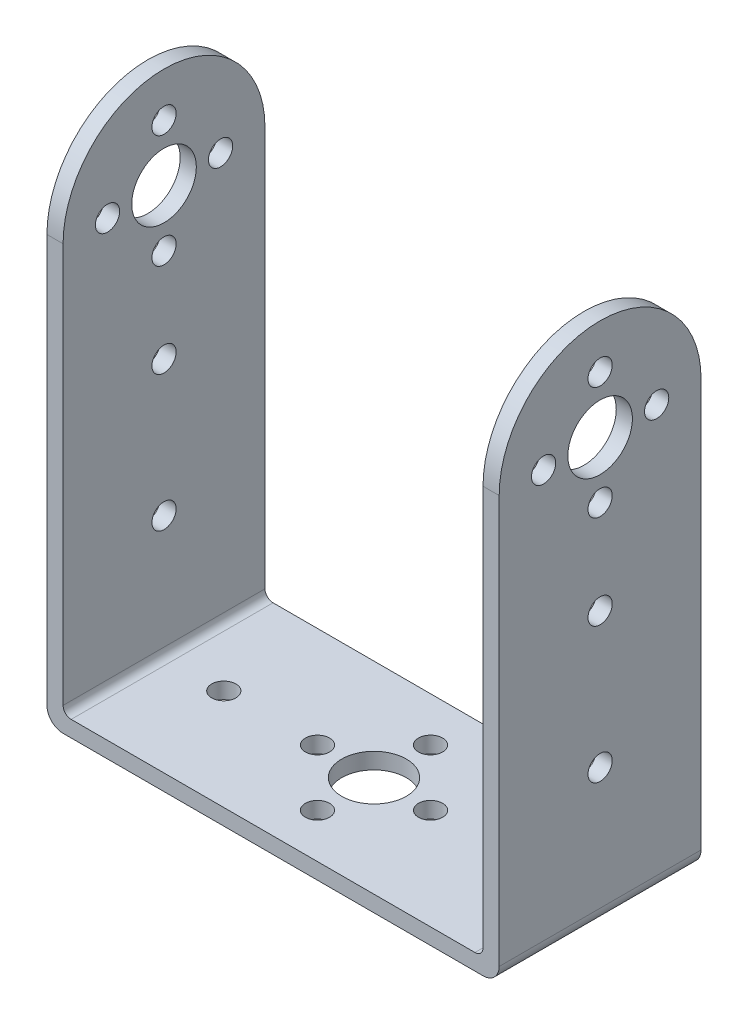
ISO-10303-21;
HEADER;
FILE_DESCRIPTION(('STEP AP214'),'2;1');
FILE_NAME('part.step','',(''),(''),'','','');
FILE_SCHEMA(('AUTOMOTIVE_DESIGN { 1 0 10303 214 1 1 1 1 }'));
ENDSEC;
DATA;
#1=APPLICATION_CONTEXT('core data for automotive mechanical design processes');
#2=APPLICATION_PROTOCOL_DEFINITION('international standard','automotive_design',2000,#1);
#3=PRODUCT_CONTEXT('',#1,'mechanical');
#4=PRODUCT('Part','Part','',(#3));
#5=PRODUCT_RELATED_PRODUCT_CATEGORY('part','',(#4));
#6=PRODUCT_DEFINITION_FORMATION('','',#4);
#7=PRODUCT_DEFINITION_CONTEXT('part definition',#1,'design');
#8=PRODUCT_DEFINITION('design','',#6,#7);
#9=PRODUCT_DEFINITION_SHAPE('','',#8);
#10=(LENGTH_UNIT() NAMED_UNIT(*) SI_UNIT(.MILLI.,.METRE.));
#11=(NAMED_UNIT(*) PLANE_ANGLE_UNIT() SI_UNIT($,.RADIAN.));
#12=(NAMED_UNIT(*) SI_UNIT($,.STERADIAN.) SOLID_ANGLE_UNIT());
#13=UNCERTAINTY_MEASURE_WITH_UNIT(LENGTH_MEASURE(1.E-05),#10,'distance_accuracy_value','');
#14=(GEOMETRIC_REPRESENTATION_CONTEXT(3) GLOBAL_UNCERTAINTY_ASSIGNED_CONTEXT((#13)) GLOBAL_UNIT_ASSIGNED_CONTEXT((#10,
#11,#12)) REPRESENTATION_CONTEXT('',''));
#15=CARTESIAN_POINT('',(0.,0.,0.));
#16=DIRECTION('',(0.,0.,1.));
#17=DIRECTION('',(1.,0.,0.));
#18=AXIS2_PLACEMENT_3D('',#15,#16,#17);
#19=CARTESIAN_POINT('',(1.99999999999998,99.5,0.));
#20=DIRECTION('',(-1.,0.,0.));
#21=DIRECTION('',(0.,-1.,0.));
#22=AXIS2_PLACEMENT_3D('',#19,#20,#21);
#23=PLANE('',#22);
#24=CARTESIAN_POINT('',(2.,50.,5.5));
#25=DIRECTION('',(1.,0.,0.));
#26=DIRECTION('',(0.,0.,-1.));
#27=AXIS2_PLACEMENT_3D('',#24,#25,#26);
#28=CIRCLE('',#27,1.49999999999999);
#29=CARTESIAN_POINT('',(2.,50.,4.00000000000001));
#30=VERTEX_POINT('',#29);
#31=EDGE_CURVE('E310',#30,#30,#28,.T.);
#32=ORIENTED_EDGE('',*,*,#31,.F.);
#33=EDGE_LOOP('',(#32));
#34=FACE_BOUND('',#33,.T.);
#35=CARTESIAN_POINT('',(2.,57.,12.5));
#36=DIRECTION('',(1.,0.,0.));
#37=DIRECTION('',(0.,0.,-1.));
#38=AXIS2_PLACEMENT_3D('',#35,#36,#37);
#39=CIRCLE('',#38,1.49999999999999);
#40=CARTESIAN_POINT('',(2.,57.,11.));
#41=VERTEX_POINT('',#40);
#42=EDGE_CURVE('E304',#41,#41,#39,.T.);
#43=ORIENTED_EDGE('',*,*,#42,.F.);
#44=EDGE_LOOP('',(#43));
#45=FACE_BOUND('',#44,.T.);
#46=CARTESIAN_POINT('',(2.,31.4,12.5));
#47=DIRECTION('',(1.,0.,0.));
#48=DIRECTION('',(0.,0.,-1.));
#49=AXIS2_PLACEMENT_3D('',#46,#47,#48);
#50=CIRCLE('',#49,1.49999999999999);
#51=CARTESIAN_POINT('',(2.,31.4,11.));
#52=VERTEX_POINT('',#51);
#53=EDGE_CURVE('E298',#52,#52,#50,.T.);
#54=ORIENTED_EDGE('',*,*,#53,.F.);
#55=EDGE_LOOP('',(#54));
#56=FACE_BOUND('',#55,.T.);
#57=CARTESIAN_POINT('',(2.,43.,12.5));
#58=DIRECTION('',(1.,0.,0.));
#59=DIRECTION('',(0.,0.,-1.));
#60=AXIS2_PLACEMENT_3D('',#57,#58,#59);
#61=CIRCLE('',#60,1.49999999999999);
#62=CARTESIAN_POINT('',(2.,43.,11.));
#63=VERTEX_POINT('',#62);
#64=EDGE_CURVE('E292',#63,#63,#61,.T.);
#65=ORIENTED_EDGE('',*,*,#64,.F.);
#66=EDGE_LOOP('',(#65));
#67=FACE_BOUND('',#66,.T.);
#68=CARTESIAN_POINT('',(2.,50.,19.5));
#69=DIRECTION('',(1.,0.,0.));
#70=DIRECTION('',(0.,0.,-1.));
#71=AXIS2_PLACEMENT_3D('',#68,#69,#70);
#72=CIRCLE('',#71,1.49999999999999);
#73=CARTESIAN_POINT('',(2.,50.,18.));
#74=VERTEX_POINT('',#73);
#75=EDGE_CURVE('E286',#74,#74,#72,.T.);
#76=ORIENTED_EDGE('',*,*,#75,.F.);
#77=EDGE_LOOP('',(#76));
#78=FACE_BOUND('',#77,.T.);
#79=CARTESIAN_POINT('',(2.,50.,12.5));
#80=DIRECTION('',(1.,0.,0.));
#81=DIRECTION('',(0.,0.,-1.));
#82=AXIS2_PLACEMENT_3D('',#79,#80,#81);
#83=CIRCLE('',#82,3.99999999999999);
#84=CARTESIAN_POINT('',(2.,50.,8.50000000000001));
#85=VERTEX_POINT('',#84);
#86=EDGE_CURVE('E238',#85,#85,#83,.T.);
#87=ORIENTED_EDGE('',*,*,#86,.F.);
#88=EDGE_LOOP('',(#87));
#89=FACE_BOUND('',#88,.T.);
#90=DIRECTION('',(0.,-1.,0.));
#91=VECTOR('',#90,1.);
#92=CARTESIAN_POINT('',(1.99999999999999,50.,25.));
#93=LINE('',#92,#91);
#94=CARTESIAN_POINT('',(1.99999999999999,50.,25.));
#95=VERTEX_POINT('',#94);
#96=CARTESIAN_POINT('',(2.,0.5,25.));
#97=VERTEX_POINT('',#96);
#98=EDGE_CURVE('E154',#95,#97,#93,.T.);
#99=ORIENTED_EDGE('',*,*,#98,.T.);
#100=DIRECTION('',(0.,0.,1.));
#101=VECTOR('',#100,1.);
#102=CARTESIAN_POINT('',(2.,0.5,0.));
#103=LINE('',#102,#101);
#104=CARTESIAN_POINT('',(2.,0.5,0.));
#105=VERTEX_POINT('',#104);
#106=EDGE_CURVE('E133',#97,#105,#103,.F.);
#107=ORIENTED_EDGE('',*,*,#106,.T.);
#108=DIRECTION('',(0.,-1.,0.));
#109=VECTOR('',#108,1.);
#110=CARTESIAN_POINT('',(1.99999999999998,99.5,0.));
#111=LINE('',#110,#109);
#112=CARTESIAN_POINT('',(1.99999999999999,50.,0.));
#113=VERTEX_POINT('',#112);
#114=EDGE_CURVE('E126',#113,#105,#111,.T.);
#115=ORIENTED_EDGE('',*,*,#114,.F.);
#116=CARTESIAN_POINT('',(1.99999999999999,50.,12.5));
#117=DIRECTION('',(-1.,0.,0.));
#118=DIRECTION('',(0.,-1.,0.));
#119=AXIS2_PLACEMENT_3D('',#116,#117,#118);
#120=CIRCLE('',#119,12.5);
#121=EDGE_CURVE('E130',#113,#95,#120,.F.);
#122=ORIENTED_EDGE('',*,*,#121,.T.);
#123=EDGE_LOOP('',(#99,#107,#115,#122));
#124=FACE_BOUND('',#123,.T.);
#125=CARTESIAN_POINT('',(2.,14.6,12.5));
#126=DIRECTION('',(1.,0.,0.));
#127=DIRECTION('',(0.,0.,-1.));
#128=AXIS2_PLACEMENT_3D('',#125,#126,#127);
#129=CIRCLE('',#128,1.49999999999999);
#130=CARTESIAN_POINT('',(2.,14.6,11.));
#131=VERTEX_POINT('',#130);
#132=EDGE_CURVE('E280',#131,#131,#129,.T.);
#133=ORIENTED_EDGE('',*,*,#132,.F.);
#134=EDGE_LOOP('',(#133));
#135=FACE_BOUND('',#134,.T.);
#136=ADVANCED_FACE('F34',(#34,#45,#56,#67,#78,#89,#124,#135),#23,.F.);
#137=CARTESIAN_POINT('',(0.,50.,12.5));
#138=DIRECTION('',(1.,0.,0.));
#139=DIRECTION('',(0.,0.,-1.));
#140=AXIS2_PLACEMENT_3D('',#137,#138,#139);
#141=CYLINDRICAL_SURFACE('',#140,12.5);
#142=CARTESIAN_POINT('',(54.,50.,12.5));
#143=DIRECTION('',(1.,0.,0.));
#144=DIRECTION('',(0.,0.,-1.));
#145=AXIS2_PLACEMENT_3D('',#142,#143,#144);
#146=CIRCLE('',#145,12.5);
#147=CARTESIAN_POINT('',(54.,50.,25.));
#148=VERTEX_POINT('',#147);
#149=CARTESIAN_POINT('',(54.,50.,0.));
#150=VERTEX_POINT('',#149);
#151=EDGE_CURVE('E148',#148,#150,#146,.F.);
#152=ORIENTED_EDGE('',*,*,#151,.F.);
#153=DIRECTION('',(1.,0.,0.));
#154=VECTOR('',#153,1.);
#155=CARTESIAN_POINT('',(0.,50.,25.));
#156=LINE('',#155,#154);
#157=CARTESIAN_POINT('',(56.,50.,25.));
#158=VERTEX_POINT('',#157);
#159=EDGE_CURVE('E169',#148,#158,#156,.T.);
#160=ORIENTED_EDGE('',*,*,#159,.T.);
#161=CARTESIAN_POINT('',(56.,50.,12.5));
#162=DIRECTION('',(1.,0.,0.));
#163=DIRECTION('',(0.,0.,-1.));
#164=AXIS2_PLACEMENT_3D('',#161,#162,#163);
#165=CIRCLE('',#164,12.5);
#166=CARTESIAN_POINT('',(56.,50.,0.));
#167=VERTEX_POINT('',#166);
#168=EDGE_CURVE('E213',#167,#158,#165,.T.);
#169=ORIENTED_EDGE('',*,*,#168,.F.);
#170=DIRECTION('',(1.,0.,0.));
#171=VECTOR('',#170,1.);
#172=CARTESIAN_POINT('',(0.,50.,0.));
#173=LINE('',#172,#171);
#174=EDGE_CURVE('E155',#150,#167,#173,.T.);
#175=ORIENTED_EDGE('',*,*,#174,.F.);
#176=EDGE_LOOP('',(#152,#160,#169,#175));
#177=FACE_BOUND('',#176,.T.);
#178=ADVANCED_FACE('F391',(#177),#141,.T.);
#179=ORIENTED_EDGE('',*,*,#121,.F.);
#180=CARTESIAN_POINT('',(0.,50.,0.));
#181=VERTEX_POINT('',#180);
#182=EDGE_CURVE('E145',#181,#113,#173,.T.);
#183=ORIENTED_EDGE('',*,*,#182,.F.);
#184=CARTESIAN_POINT('',(0.,50.,12.5));
#185=DIRECTION('',(1.,0.,0.));
#186=DIRECTION('',(0.,0.,-1.));
#187=AXIS2_PLACEMENT_3D('',#184,#185,#186);
#188=CIRCLE('',#187,12.5);
#189=CARTESIAN_POINT('',(0.,50.,25.));
#190=VERTEX_POINT('',#189);
#191=EDGE_CURVE('E208',#181,#190,#188,.T.);
#192=ORIENTED_EDGE('',*,*,#191,.T.);
#193=EDGE_CURVE('E147',#190,#95,#156,.T.);
#194=ORIENTED_EDGE('',*,*,#193,.T.);
#195=EDGE_LOOP('',(#179,#183,#192,#194));
#196=FACE_BOUND('',#195,.T.);
#197=ADVANCED_FACE('F143',(#196),#141,.T.);
#198=CARTESIAN_POINT('',(0.,-2.5,0.));
#199=DIRECTION('',(0.,0.,-1.));
#200=DIRECTION('',(-1.,0.,0.));
#201=AXIS2_PLACEMENT_3D('',#198,#199,#200);
#202=PLANE('',#201);
#203=DIRECTION('',(1.,0.,0.));
#204=VECTOR('',#203,1.);
#205=CARTESIAN_POINT('',(0.,-2.5,0.));
#206=LINE('',#205,#204);
#207=CARTESIAN_POINT('',(2.,-2.5,0.));
#208=VERTEX_POINT('',#207);
#209=CARTESIAN_POINT('',(54.,-2.5,0.));
#210=VERTEX_POINT('',#209);
#211=EDGE_CURVE('E160',#208,#210,#206,.T.);
#212=ORIENTED_EDGE('',*,*,#211,.F.);
#213=CARTESIAN_POINT('',(2.,-0.500000000000002,0.));
#214=DIRECTION('',(0.,0.,-1.));
#215=DIRECTION('',(-1.,0.,0.));
#216=AXIS2_PLACEMENT_3D('',#213,#214,#215);
#217=CIRCLE('',#216,2.);
#218=CARTESIAN_POINT('',(0.,-0.500000000000002,0.));
#219=VERTEX_POINT('',#218);
#220=EDGE_CURVE('E194',#208,#219,#217,.T.);
#221=ORIENTED_EDGE('',*,*,#220,.T.);
#222=DIRECTION('',(0.,1.,0.));
#223=VECTOR('',#222,1.);
#224=CARTESIAN_POINT('',(0.,-2.5,0.));
#225=LINE('',#224,#223);
#226=EDGE_CURVE('E153',#219,#181,#225,.T.);
#227=ORIENTED_EDGE('',*,*,#226,.T.);
#228=ORIENTED_EDGE('',*,*,#182,.T.);
#229=ORIENTED_EDGE('',*,*,#114,.T.);
#230=CARTESIAN_POINT('',(3.,0.5,0.));
#231=DIRECTION('',(0.,0.,-1.));
#232=DIRECTION('',(-1.,0.,0.));
#233=AXIS2_PLACEMENT_3D('',#230,#231,#232);
#234=CIRCLE('',#233,1.);
#235=CARTESIAN_POINT('',(3.,-0.5,0.));
#236=VERTEX_POINT('',#235);
#237=EDGE_CURVE('E181',#105,#236,#234,.F.);
#238=ORIENTED_EDGE('',*,*,#237,.T.);
#239=DIRECTION('',(1.,0.,0.));
#240=VECTOR('',#239,1.);
#241=CARTESIAN_POINT('',(2.,-0.5,0.));
#242=LINE('',#241,#240);
#243=CARTESIAN_POINT('',(53.,-0.5,0.));
#244=VERTEX_POINT('',#243);
#245=EDGE_CURVE('E137',#236,#244,#242,.T.);
#246=ORIENTED_EDGE('',*,*,#245,.T.);
#247=CARTESIAN_POINT('',(53.,0.5,0.));
#248=DIRECTION('',(0.,0.,-1.));
#249=DIRECTION('',(-1.,0.,0.));
#250=AXIS2_PLACEMENT_3D('',#247,#248,#249);
#251=CIRCLE('',#250,1.);
#252=CARTESIAN_POINT('',(54.,0.5,0.));
#253=VERTEX_POINT('',#252);
#254=EDGE_CURVE('E185',#244,#253,#251,.F.);
#255=ORIENTED_EDGE('',*,*,#254,.T.);
#256=DIRECTION('',(0.,1.,0.));
#257=VECTOR('',#256,1.);
#258=CARTESIAN_POINT('',(54.,-0.5,0.));
#259=LINE('',#258,#257);
#260=EDGE_CURVE('E149',#253,#150,#259,.T.);
#261=ORIENTED_EDGE('',*,*,#260,.T.);
#262=ORIENTED_EDGE('',*,*,#174,.T.);
#263=DIRECTION('',(0.,1.,0.));
#264=VECTOR('',#263,1.);
#265=CARTESIAN_POINT('',(56.,-2.5,0.));
#266=LINE('',#265,#264);
#267=CARTESIAN_POINT('',(56.,-0.500000000000001,0.));
#268=VERTEX_POINT('',#267);
#269=EDGE_CURVE('E163',#268,#167,#266,.T.);
#270=ORIENTED_EDGE('',*,*,#269,.F.);
#271=CARTESIAN_POINT('',(54.,-0.500000000000001,0.));
#272=DIRECTION('',(0.,0.,-1.));
#273=DIRECTION('',(-1.,0.,0.));
#274=AXIS2_PLACEMENT_3D('',#271,#272,#273);
#275=CIRCLE('',#274,2.);
#276=EDGE_CURVE('E192',#268,#210,#275,.T.);
#277=ORIENTED_EDGE('',*,*,#276,.T.);
#278=EDGE_LOOP('',(#212,#221,#227,#228,#229,#238,#246,#255,#261,#262,#270,#277));
#279=FACE_BOUND('',#278,.T.);
#280=ADVANCED_FACE('F152',(#279),#202,.T.);
#281=CARTESIAN_POINT('',(0.,-2.5,25.));
#282=DIRECTION('',(0.,-1.,0.));
#283=DIRECTION('',(0.,0.,-1.));
#284=AXIS2_PLACEMENT_3D('',#281,#282,#283);
#285=PLANE('',#284);
#286=CARTESIAN_POINT('',(28.,-2.5,12.5));
#287=DIRECTION('',(0.,-1.,0.));
#288=DIRECTION('',(0.,0.,-1.));
#289=AXIS2_PLACEMENT_3D('',#286,#287,#288);
#290=CIRCLE('',#289,3.99999999999999);
#291=CARTESIAN_POINT('',(28.,-2.5,8.50000000000001));
#292=VERTEX_POINT('',#291);
#293=EDGE_CURVE('E352',#292,#292,#290,.T.);
#294=ORIENTED_EDGE('',*,*,#293,.F.);
#295=EDGE_LOOP('',(#294));
#296=FACE_BOUND('',#295,.T.);
#297=CARTESIAN_POINT('',(46.6,-2.5,12.5));
#298=DIRECTION('',(0.,-1.,0.));
#299=DIRECTION('',(0.,0.,-1.));
#300=AXIS2_PLACEMENT_3D('',#297,#298,#299);
#301=CIRCLE('',#300,1.49999999999999);
#302=CARTESIAN_POINT('',(46.6,-2.5,11.));
#303=VERTEX_POINT('',#302);
#304=EDGE_CURVE('E346',#303,#303,#301,.T.);
#305=ORIENTED_EDGE('',*,*,#304,.F.);
#306=EDGE_LOOP('',(#305));
#307=FACE_BOUND('',#306,.T.);
#308=CARTESIAN_POINT('',(21.,-2.5,12.5));
#309=DIRECTION('',(0.,-1.,0.));
#310=DIRECTION('',(0.,0.,-1.));
#311=AXIS2_PLACEMENT_3D('',#308,#309,#310);
#312=CIRCLE('',#311,1.49999999999999);
#313=CARTESIAN_POINT('',(21.,-2.5,11.));
#314=VERTEX_POINT('',#313);
#315=EDGE_CURVE('E340',#314,#314,#312,.T.);
#316=ORIENTED_EDGE('',*,*,#315,.F.);
#317=EDGE_LOOP('',(#316));
#318=FACE_BOUND('',#317,.T.);
#319=CARTESIAN_POINT('',(35.,-2.5,12.5));
#320=DIRECTION('',(0.,-1.,0.));
#321=DIRECTION('',(0.,0.,-1.));
#322=AXIS2_PLACEMENT_3D('',#319,#320,#321);
#323=CIRCLE('',#322,1.49999999999999);
#324=CARTESIAN_POINT('',(35.,-2.5,11.));
#325=VERTEX_POINT('',#324);
#326=EDGE_CURVE('E334',#325,#325,#323,.T.);
#327=ORIENTED_EDGE('',*,*,#326,.F.);
#328=EDGE_LOOP('',(#327));
#329=FACE_BOUND('',#328,.T.);
#330=CARTESIAN_POINT('',(9.4,-2.5,12.5));
#331=DIRECTION('',(0.,-1.,0.));
#332=DIRECTION('',(0.,0.,-1.));
#333=AXIS2_PLACEMENT_3D('',#330,#331,#332);
#334=CIRCLE('',#333,1.49999999999999);
#335=CARTESIAN_POINT('',(9.4,-2.5,11.));
#336=VERTEX_POINT('',#335);
#337=EDGE_CURVE('E328',#336,#336,#334,.T.);
#338=ORIENTED_EDGE('',*,*,#337,.F.);
#339=EDGE_LOOP('',(#338));
#340=FACE_BOUND('',#339,.T.);
#341=CARTESIAN_POINT('',(28.,-2.5,19.5));
#342=DIRECTION('',(0.,-1.,0.));
#343=DIRECTION('',(0.,0.,-1.));
#344=AXIS2_PLACEMENT_3D('',#341,#342,#343);
#345=CIRCLE('',#344,1.49999999999999);
#346=CARTESIAN_POINT('',(28.,-2.5,18.));
#347=VERTEX_POINT('',#346);
#348=EDGE_CURVE('E322',#347,#347,#345,.T.);
#349=ORIENTED_EDGE('',*,*,#348,.F.);
#350=EDGE_LOOP('',(#349));
#351=FACE_BOUND('',#350,.T.);
#352=CARTESIAN_POINT('',(28.,-2.5,5.5));
#353=DIRECTION('',(0.,-1.,0.));
#354=DIRECTION('',(0.,0.,-1.));
#355=AXIS2_PLACEMENT_3D('',#352,#353,#354);
#356=CIRCLE('',#355,1.49999999999999);
#357=CARTESIAN_POINT('',(28.,-2.5,4.00000000000001));
#358=VERTEX_POINT('',#357);
#359=EDGE_CURVE('E316',#358,#358,#356,.T.);
#360=ORIENTED_EDGE('',*,*,#359,.F.);
#361=EDGE_LOOP('',(#360));
#362=FACE_BOUND('',#361,.T.);
#363=DIRECTION('',(1.,0.,0.));
#364=VECTOR('',#363,1.);
#365=CARTESIAN_POINT('',(0.,-2.5,25.));
#366=LINE('',#365,#364);
#367=CARTESIAN_POINT('',(2.,-2.5,25.));
#368=VERTEX_POINT('',#367);
#369=CARTESIAN_POINT('',(54.,-2.5,25.));
#370=VERTEX_POINT('',#369);
#371=EDGE_CURVE('E167',#368,#370,#366,.T.);
#372=ORIENTED_EDGE('',*,*,#371,.F.);
#373=DIRECTION('',(0.,0.,-1.));
#374=VECTOR('',#373,1.);
#375=CARTESIAN_POINT('',(2.,-2.5,0.));
#376=LINE('',#375,#374);
#377=EDGE_CURVE('E189',#368,#208,#376,.T.);
#378=ORIENTED_EDGE('',*,*,#377,.T.);
#379=ORIENTED_EDGE('',*,*,#211,.T.);
#380=DIRECTION('',(0.,0.,-1.));
#381=VECTOR('',#380,1.);
#382=CARTESIAN_POINT('',(54.,-2.5,25.));
#383=LINE('',#382,#381);
#384=EDGE_CURVE('E187',#210,#370,#383,.F.);
#385=ORIENTED_EDGE('',*,*,#384,.T.);
#386=EDGE_LOOP('',(#372,#378,#379,#385));
#387=FACE_BOUND('',#386,.T.);
#388=ADVANCED_FACE('F204',(#296,#307,#318,#329,#340,#351,#362,#387),#285,.T.);
#389=CARTESIAN_POINT('',(0.,50.,25.));
#390=DIRECTION('',(0.,0.,1.));
#391=DIRECTION('',(1.,0.,0.));
#392=AXIS2_PLACEMENT_3D('',#389,#390,#391);
#393=PLANE('',#392);
#394=DIRECTION('',(0.,-1.,0.));
#395=VECTOR('',#394,1.);
#396=CARTESIAN_POINT('',(0.,50.,25.));
#397=LINE('',#396,#395);
#398=CARTESIAN_POINT('',(0.,-0.5,25.));
#399=VERTEX_POINT('',#398);
#400=EDGE_CURVE('E200',#190,#399,#397,.T.);
#401=ORIENTED_EDGE('',*,*,#400,.T.);
#402=CARTESIAN_POINT('',(2.,-0.500000000000001,25.));
#403=DIRECTION('',(0.,0.,1.));
#404=DIRECTION('',(1.,0.,0.));
#405=AXIS2_PLACEMENT_3D('',#402,#403,#404);
#406=CIRCLE('',#405,2.);
#407=EDGE_CURVE('E42',#399,#368,#406,.T.);
#408=ORIENTED_EDGE('',*,*,#407,.T.);
#409=ORIENTED_EDGE('',*,*,#371,.T.);
#410=CARTESIAN_POINT('',(54.,-0.5,25.));
#411=DIRECTION('',(0.,0.,1.));
#412=DIRECTION('',(1.,0.,0.));
#413=AXIS2_PLACEMENT_3D('',#410,#411,#412);
#414=CIRCLE('',#413,2.);
#415=CARTESIAN_POINT('',(56.,-0.5,25.));
#416=VERTEX_POINT('',#415);
#417=EDGE_CURVE('E49',#370,#416,#414,.T.);
#418=ORIENTED_EDGE('',*,*,#417,.T.);
#419=DIRECTION('',(0.,-1.,0.));
#420=VECTOR('',#419,1.);
#421=CARTESIAN_POINT('',(56.,50.,25.));
#422=LINE('',#421,#420);
#423=EDGE_CURVE('E215',#158,#416,#422,.T.);
#424=ORIENTED_EDGE('',*,*,#423,.F.);
#425=ORIENTED_EDGE('',*,*,#159,.F.);
#426=DIRECTION('',(0.,1.,0.));
#427=VECTOR('',#426,1.);
#428=CARTESIAN_POINT('',(54.,-0.5,25.));
#429=LINE('',#428,#427);
#430=CARTESIAN_POINT('',(54.,0.5,25.));
#431=VERTEX_POINT('',#430);
#432=EDGE_CURVE('E138',#431,#148,#429,.T.);
#433=ORIENTED_EDGE('',*,*,#432,.F.);
#434=CARTESIAN_POINT('',(53.,0.5,25.));
#435=DIRECTION('',(0.,0.,1.));
#436=DIRECTION('',(1.,0.,0.));
#437=AXIS2_PLACEMENT_3D('',#434,#435,#436);
#438=CIRCLE('',#437,1.);
#439=CARTESIAN_POINT('',(53.,-0.5,25.));
#440=VERTEX_POINT('',#439);
#441=EDGE_CURVE('E183',#431,#440,#438,.F.);
#442=ORIENTED_EDGE('',*,*,#441,.T.);
#443=DIRECTION('',(1.,0.,0.));
#444=VECTOR('',#443,1.);
#445=CARTESIAN_POINT('',(2.,-0.5,25.));
#446=LINE('',#445,#444);
#447=CARTESIAN_POINT('',(3.,-0.5,25.));
#448=VERTEX_POINT('',#447);
#449=EDGE_CURVE('E223',#448,#440,#446,.T.);
#450=ORIENTED_EDGE('',*,*,#449,.F.);
#451=CARTESIAN_POINT('',(3.,0.5,25.));
#452=DIRECTION('',(0.,0.,1.));
#453=DIRECTION('',(1.,0.,0.));
#454=AXIS2_PLACEMENT_3D('',#451,#452,#453);
#455=CIRCLE('',#454,1.);
#456=EDGE_CURVE('E179',#448,#97,#455,.F.);
#457=ORIENTED_EDGE('',*,*,#456,.T.);
#458=ORIENTED_EDGE('',*,*,#98,.F.);
#459=ORIENTED_EDGE('',*,*,#193,.F.);
#460=EDGE_LOOP('',(#401,#408,#409,#418,#424,#425,#433,#442,#450,#457,#458,#459));
#461=FACE_BOUND('',#460,.T.);
#462=ADVANCED_FACE('F199',(#461),#393,.T.);
#463=CARTESIAN_POINT('',(0.,50.,12.5));
#464=DIRECTION('',(1.,0.,0.));
#465=DIRECTION('',(0.,0.,-1.));
#466=AXIS2_PLACEMENT_3D('',#463,#464,#465);
#467=PLANE('',#466);
#468=CARTESIAN_POINT('',(0.,50.,5.5));
#469=DIRECTION('',(1.,0.,0.));
#470=DIRECTION('',(0.,0.,-1.));
#471=AXIS2_PLACEMENT_3D('',#468,#469,#470);
#472=CIRCLE('',#471,1.49999999999999);
#473=CARTESIAN_POINT('',(0.,50.,4.00000000000001));
#474=VERTEX_POINT('',#473);
#475=EDGE_CURVE('E307',#474,#474,#472,.T.);
#476=ORIENTED_EDGE('',*,*,#475,.T.);
#477=EDGE_LOOP('',(#476));
#478=FACE_BOUND('',#477,.T.);
#479=CARTESIAN_POINT('',(0.,57.,12.5));
#480=DIRECTION('',(1.,0.,0.));
#481=DIRECTION('',(0.,0.,-1.));
#482=AXIS2_PLACEMENT_3D('',#479,#480,#481);
#483=CIRCLE('',#482,1.49999999999999);
#484=CARTESIAN_POINT('',(0.,57.,11.));
#485=VERTEX_POINT('',#484);
#486=EDGE_CURVE('E301',#485,#485,#483,.T.);
#487=ORIENTED_EDGE('',*,*,#486,.T.);
#488=EDGE_LOOP('',(#487));
#489=FACE_BOUND('',#488,.T.);
#490=CARTESIAN_POINT('',(0.,31.4,12.5));
#491=DIRECTION('',(1.,0.,0.));
#492=DIRECTION('',(0.,0.,-1.));
#493=AXIS2_PLACEMENT_3D('',#490,#491,#492);
#494=CIRCLE('',#493,1.49999999999999);
#495=CARTESIAN_POINT('',(0.,31.4,11.));
#496=VERTEX_POINT('',#495);
#497=EDGE_CURVE('E295',#496,#496,#494,.T.);
#498=ORIENTED_EDGE('',*,*,#497,.T.);
#499=EDGE_LOOP('',(#498));
#500=FACE_BOUND('',#499,.T.);
#501=CARTESIAN_POINT('',(0.,43.,12.5));
#502=DIRECTION('',(1.,0.,0.));
#503=DIRECTION('',(0.,0.,-1.));
#504=AXIS2_PLACEMENT_3D('',#501,#502,#503);
#505=CIRCLE('',#504,1.49999999999999);
#506=CARTESIAN_POINT('',(0.,43.,11.));
#507=VERTEX_POINT('',#506);
#508=EDGE_CURVE('E289',#507,#507,#505,.T.);
#509=ORIENTED_EDGE('',*,*,#508,.T.);
#510=EDGE_LOOP('',(#509));
#511=FACE_BOUND('',#510,.T.);
#512=CARTESIAN_POINT('',(0.,50.,19.5));
#513=DIRECTION('',(1.,0.,0.));
#514=DIRECTION('',(0.,0.,-1.));
#515=AXIS2_PLACEMENT_3D('',#512,#513,#514);
#516=CIRCLE('',#515,1.49999999999999);
#517=CARTESIAN_POINT('',(0.,50.,18.));
#518=VERTEX_POINT('',#517);
#519=EDGE_CURVE('E283',#518,#518,#516,.T.);
#520=ORIENTED_EDGE('',*,*,#519,.T.);
#521=EDGE_LOOP('',(#520));
#522=FACE_BOUND('',#521,.T.);
#523=CARTESIAN_POINT('',(0.,14.6,12.5));
#524=DIRECTION('',(1.,0.,0.));
#525=DIRECTION('',(0.,0.,-1.));
#526=AXIS2_PLACEMENT_3D('',#523,#524,#525);
#527=CIRCLE('',#526,1.49999999999999);
#528=CARTESIAN_POINT('',(0.,14.6,11.));
#529=VERTEX_POINT('',#528);
#530=EDGE_CURVE('E277',#529,#529,#527,.T.);
#531=ORIENTED_EDGE('',*,*,#530,.T.);
#532=EDGE_LOOP('',(#531));
#533=FACE_BOUND('',#532,.T.);
#534=CARTESIAN_POINT('',(0.,50.,12.5));
#535=DIRECTION('',(1.,0.,0.));
#536=DIRECTION('',(0.,0.,-1.));
#537=AXIS2_PLACEMENT_3D('',#534,#535,#536);
#538=CIRCLE('',#537,3.99999999999999);
#539=CARTESIAN_POINT('',(0.,50.,8.50000000000001));
#540=VERTEX_POINT('',#539);
#541=EDGE_CURVE('E235',#540,#540,#538,.T.);
#542=ORIENTED_EDGE('',*,*,#541,.T.);
#543=EDGE_LOOP('',(#542));
#544=FACE_BOUND('',#543,.T.);
#545=ORIENTED_EDGE('',*,*,#226,.F.);
#546=DIRECTION('',(0.,0.,-1.));
#547=VECTOR('',#546,1.);
#548=CARTESIAN_POINT('',(0.,-0.500000000000001,25.));
#549=LINE('',#548,#547);
#550=EDGE_CURVE('E57',#219,#399,#549,.F.);
#551=ORIENTED_EDGE('',*,*,#550,.T.);
#552=ORIENTED_EDGE('',*,*,#400,.F.);
#553=ORIENTED_EDGE('',*,*,#191,.F.);
#554=EDGE_LOOP('',(#545,#551,#552,#553));
#555=FACE_BOUND('',#554,.T.);
#556=ADVANCED_FACE('F207',(#478,#489,#500,#511,#522,#533,#544,#555),#467,.F.);
#557=CARTESIAN_POINT('',(56.,50.,12.5));
#558=DIRECTION('',(1.,0.,0.));
#559=DIRECTION('',(0.,0.,-1.));
#560=AXIS2_PLACEMENT_3D('',#557,#558,#559);
#561=PLANE('',#560);
#562=CARTESIAN_POINT('',(56.,50.,5.5));
#563=DIRECTION('',(1.,0.,0.));
#564=DIRECTION('',(0.,0.,-1.));
#565=AXIS2_PLACEMENT_3D('',#562,#563,#564);
#566=CIRCLE('',#565,1.49999999999999);
#567=CARTESIAN_POINT('',(56.,50.,4.00000000000001));
#568=VERTEX_POINT('',#567);
#569=EDGE_CURVE('E274',#568,#568,#566,.T.);
#570=ORIENTED_EDGE('',*,*,#569,.F.);
#571=EDGE_LOOP('',(#570));
#572=FACE_BOUND('',#571,.T.);
#573=CARTESIAN_POINT('',(56.,57.,12.5));
#574=DIRECTION('',(1.,0.,0.));
#575=DIRECTION('',(0.,0.,-1.));
#576=AXIS2_PLACEMENT_3D('',#573,#574,#575);
#577=CIRCLE('',#576,1.49999999999999);
#578=CARTESIAN_POINT('',(56.,57.,11.));
#579=VERTEX_POINT('',#578);
#580=EDGE_CURVE('E268',#579,#579,#577,.T.);
#581=ORIENTED_EDGE('',*,*,#580,.F.);
#582=EDGE_LOOP('',(#581));
#583=FACE_BOUND('',#582,.T.);
#584=CARTESIAN_POINT('',(56.,31.4,12.5));
#585=DIRECTION('',(1.,0.,0.));
#586=DIRECTION('',(0.,0.,-1.));
#587=AXIS2_PLACEMENT_3D('',#584,#585,#586);
#588=CIRCLE('',#587,1.49999999999999);
#589=CARTESIAN_POINT('',(56.,31.4,11.));
#590=VERTEX_POINT('',#589);
#591=EDGE_CURVE('E262',#590,#590,#588,.T.);
#592=ORIENTED_EDGE('',*,*,#591,.F.);
#593=EDGE_LOOP('',(#592));
#594=FACE_BOUND('',#593,.T.);
#595=CARTESIAN_POINT('',(56.,43.,12.5));
#596=DIRECTION('',(1.,0.,0.));
#597=DIRECTION('',(0.,0.,-1.));
#598=AXIS2_PLACEMENT_3D('',#595,#596,#597);
#599=CIRCLE('',#598,1.49999999999999);
#600=CARTESIAN_POINT('',(56.,43.,11.));
#601=VERTEX_POINT('',#600);
#602=EDGE_CURVE('E256',#601,#601,#599,.T.);
#603=ORIENTED_EDGE('',*,*,#602,.F.);
#604=EDGE_LOOP('',(#603));
#605=FACE_BOUND('',#604,.T.);
#606=CARTESIAN_POINT('',(56.,50.,19.5));
#607=DIRECTION('',(1.,0.,0.));
#608=DIRECTION('',(0.,0.,-1.));
#609=AXIS2_PLACEMENT_3D('',#606,#607,#608);
#610=CIRCLE('',#609,1.49999999999999);
#611=CARTESIAN_POINT('',(56.,50.,18.));
#612=VERTEX_POINT('',#611);
#613=EDGE_CURVE('E250',#612,#612,#610,.T.);
#614=ORIENTED_EDGE('',*,*,#613,.F.);
#615=EDGE_LOOP('',(#614));
#616=FACE_BOUND('',#615,.T.);
#617=CARTESIAN_POINT('',(56.,14.6,12.5));
#618=DIRECTION('',(1.,0.,0.));
#619=DIRECTION('',(0.,0.,-1.));
#620=AXIS2_PLACEMENT_3D('',#617,#618,#619);
#621=CIRCLE('',#620,1.49999999999999);
#622=CARTESIAN_POINT('',(56.,14.6,11.));
#623=VERTEX_POINT('',#622);
#624=EDGE_CURVE('E244',#623,#623,#621,.T.);
#625=ORIENTED_EDGE('',*,*,#624,.F.);
#626=EDGE_LOOP('',(#625));
#627=FACE_BOUND('',#626,.T.);
#628=CARTESIAN_POINT('',(56.,50.,12.5));
#629=DIRECTION('',(1.,0.,0.));
#630=DIRECTION('',(0.,0.,-1.));
#631=AXIS2_PLACEMENT_3D('',#628,#629,#630);
#632=CIRCLE('',#631,3.99999999999999);
#633=CARTESIAN_POINT('',(56.,50.,8.50000000000001));
#634=VERTEX_POINT('',#633);
#635=EDGE_CURVE('E232',#634,#634,#632,.T.);
#636=ORIENTED_EDGE('',*,*,#635,.F.);
#637=EDGE_LOOP('',(#636));
#638=FACE_BOUND('',#637,.T.);
#639=ORIENTED_EDGE('',*,*,#423,.T.);
#640=DIRECTION('',(0.,0.,-1.));
#641=VECTOR('',#640,1.);
#642=CARTESIAN_POINT('',(56.,-0.5,12.5));
#643=LINE('',#642,#641);
#644=EDGE_CURVE('E11',#416,#268,#643,.T.);
#645=ORIENTED_EDGE('',*,*,#644,.T.);
#646=ORIENTED_EDGE('',*,*,#269,.T.);
#647=ORIENTED_EDGE('',*,*,#168,.T.);
#648=EDGE_LOOP('',(#639,#645,#646,#647));
#649=FACE_BOUND('',#648,.T.);
#650=ADVANCED_FACE('F407',(#572,#583,#594,#605,#616,#627,#638,#649),#561,.T.);
#651=CARTESIAN_POINT('',(54.,-0.5,0.));
#652=DIRECTION('',(1.,0.,0.));
#653=DIRECTION('',(0.,0.,-1.));
#654=AXIS2_PLACEMENT_3D('',#651,#652,#653);
#655=PLANE('',#654);
#656=CARTESIAN_POINT('',(54.,50.,5.5));
#657=DIRECTION('',(1.,0.,0.));
#658=DIRECTION('',(0.,0.,-1.));
#659=AXIS2_PLACEMENT_3D('',#656,#657,#658);
#660=CIRCLE('',#659,1.49999999999999);
#661=CARTESIAN_POINT('',(54.,50.,4.00000000000001));
#662=VERTEX_POINT('',#661);
#663=EDGE_CURVE('E271',#662,#662,#660,.T.);
#664=ORIENTED_EDGE('',*,*,#663,.T.);
#665=EDGE_LOOP('',(#664));
#666=FACE_BOUND('',#665,.T.);
#667=CARTESIAN_POINT('',(54.,57.,12.5));
#668=DIRECTION('',(1.,0.,0.));
#669=DIRECTION('',(0.,0.,-1.));
#670=AXIS2_PLACEMENT_3D('',#667,#668,#669);
#671=CIRCLE('',#670,1.49999999999999);
#672=CARTESIAN_POINT('',(54.,57.,11.));
#673=VERTEX_POINT('',#672);
#674=EDGE_CURVE('E265',#673,#673,#671,.T.);
#675=ORIENTED_EDGE('',*,*,#674,.T.);
#676=EDGE_LOOP('',(#675));
#677=FACE_BOUND('',#676,.T.);
#678=CARTESIAN_POINT('',(54.,31.4,12.5));
#679=DIRECTION('',(1.,0.,0.));
#680=DIRECTION('',(0.,0.,-1.));
#681=AXIS2_PLACEMENT_3D('',#678,#679,#680);
#682=CIRCLE('',#681,1.49999999999999);
#683=CARTESIAN_POINT('',(54.,31.4,11.));
#684=VERTEX_POINT('',#683);
#685=EDGE_CURVE('E259',#684,#684,#682,.T.);
#686=ORIENTED_EDGE('',*,*,#685,.T.);
#687=EDGE_LOOP('',(#686));
#688=FACE_BOUND('',#687,.T.);
#689=CARTESIAN_POINT('',(54.,43.,12.5));
#690=DIRECTION('',(1.,0.,0.));
#691=DIRECTION('',(0.,0.,-1.));
#692=AXIS2_PLACEMENT_3D('',#689,#690,#691);
#693=CIRCLE('',#692,1.49999999999999);
#694=CARTESIAN_POINT('',(54.,43.,11.));
#695=VERTEX_POINT('',#694);
#696=EDGE_CURVE('E253',#695,#695,#693,.T.);
#697=ORIENTED_EDGE('',*,*,#696,.T.);
#698=EDGE_LOOP('',(#697));
#699=FACE_BOUND('',#698,.T.);
#700=CARTESIAN_POINT('',(54.,50.,19.5));
#701=DIRECTION('',(1.,0.,0.));
#702=DIRECTION('',(0.,0.,-1.));
#703=AXIS2_PLACEMENT_3D('',#700,#701,#702);
#704=CIRCLE('',#703,1.49999999999999);
#705=CARTESIAN_POINT('',(54.,50.,18.));
#706=VERTEX_POINT('',#705);
#707=EDGE_CURVE('E247',#706,#706,#704,.T.);
#708=ORIENTED_EDGE('',*,*,#707,.T.);
#709=EDGE_LOOP('',(#708));
#710=FACE_BOUND('',#709,.T.);
#711=CARTESIAN_POINT('',(54.,14.6,12.5));
#712=DIRECTION('',(1.,0.,0.));
#713=DIRECTION('',(0.,0.,-1.));
#714=AXIS2_PLACEMENT_3D('',#711,#712,#713);
#715=CIRCLE('',#714,1.49999999999999);
#716=CARTESIAN_POINT('',(54.,14.6,11.));
#717=VERTEX_POINT('',#716);
#718=EDGE_CURVE('E241',#717,#717,#715,.T.);
#719=ORIENTED_EDGE('',*,*,#718,.T.);
#720=EDGE_LOOP('',(#719));
#721=FACE_BOUND('',#720,.T.);
#722=CARTESIAN_POINT('',(54.,50.,12.5));
#723=DIRECTION('',(1.,0.,0.));
#724=DIRECTION('',(0.,0.,-1.));
#725=AXIS2_PLACEMENT_3D('',#722,#723,#724);
#726=CIRCLE('',#725,4.);
#727=CARTESIAN_POINT('',(54.,50.,8.5));
#728=VERTEX_POINT('',#727);
#729=EDGE_CURVE('E226',#728,#728,#726,.T.);
#730=ORIENTED_EDGE('',*,*,#729,.T.);
#731=EDGE_LOOP('',(#730));
#732=FACE_BOUND('',#731,.T.);
#733=ORIENTED_EDGE('',*,*,#260,.F.);
#734=DIRECTION('',(0.,0.,1.));
#735=VECTOR('',#734,1.);
#736=CARTESIAN_POINT('',(54.,0.5,25.));
#737=LINE('',#736,#735);
#738=EDGE_CURVE('E176',#253,#431,#737,.T.);
#739=ORIENTED_EDGE('',*,*,#738,.T.);
#740=ORIENTED_EDGE('',*,*,#432,.T.);
#741=ORIENTED_EDGE('',*,*,#151,.T.);
#742=EDGE_LOOP('',(#733,#739,#740,#741));
#743=FACE_BOUND('',#742,.T.);
#744=ADVANCED_FACE('F411',(#666,#677,#688,#699,#710,#721,#732,#743),#655,.F.);
#745=CARTESIAN_POINT('',(2.,-0.5,0.));
#746=DIRECTION('',(0.,-1.,0.));
#747=DIRECTION('',(1.,0.,0.));
#748=AXIS2_PLACEMENT_3D('',#745,#746,#747);
#749=PLANE('',#748);
#750=CARTESIAN_POINT('',(28.,-0.5,12.5));
#751=DIRECTION('',(0.,-1.,0.));
#752=DIRECTION('',(1.,0.,0.));
#753=AXIS2_PLACEMENT_3D('',#750,#751,#752);
#754=CIRCLE('',#753,3.99999999999999);
#755=CARTESIAN_POINT('',(32.,-0.5,12.5));
#756=VERTEX_POINT('',#755);
#757=EDGE_CURVE('E349',#756,#756,#754,.T.);
#758=ORIENTED_EDGE('',*,*,#757,.T.);
#759=EDGE_LOOP('',(#758));
#760=FACE_BOUND('',#759,.T.);
#761=CARTESIAN_POINT('',(46.6,-0.5,12.5));
#762=DIRECTION('',(0.,-1.,0.));
#763=DIRECTION('',(1.,0.,0.));
#764=AXIS2_PLACEMENT_3D('',#761,#762,#763);
#765=CIRCLE('',#764,1.49999999999999);
#766=CARTESIAN_POINT('',(48.1,-0.5,12.5));
#767=VERTEX_POINT('',#766);
#768=EDGE_CURVE('E343',#767,#767,#765,.T.);
#769=ORIENTED_EDGE('',*,*,#768,.T.);
#770=EDGE_LOOP('',(#769));
#771=FACE_BOUND('',#770,.T.);
#772=CARTESIAN_POINT('',(21.,-0.5,12.5));
#773=DIRECTION('',(0.,-1.,0.));
#774=DIRECTION('',(1.,0.,0.));
#775=AXIS2_PLACEMENT_3D('',#772,#773,#774);
#776=CIRCLE('',#775,1.5);
#777=CARTESIAN_POINT('',(22.5,-0.5,12.5));
#778=VERTEX_POINT('',#777);
#779=EDGE_CURVE('E337',#778,#778,#776,.T.);
#780=ORIENTED_EDGE('',*,*,#779,.T.);
#781=EDGE_LOOP('',(#780));
#782=FACE_BOUND('',#781,.T.);
#783=CARTESIAN_POINT('',(35.,-0.5,12.5));
#784=DIRECTION('',(0.,-1.,0.));
#785=DIRECTION('',(1.,0.,0.));
#786=AXIS2_PLACEMENT_3D('',#783,#784,#785);
#787=CIRCLE('',#786,1.49999999999999);
#788=CARTESIAN_POINT('',(36.5,-0.5,12.5));
#789=VERTEX_POINT('',#788);
#790=EDGE_CURVE('E331',#789,#789,#787,.T.);
#791=ORIENTED_EDGE('',*,*,#790,.T.);
#792=EDGE_LOOP('',(#791));
#793=FACE_BOUND('',#792,.T.);
#794=CARTESIAN_POINT('',(9.4,-0.5,12.5));
#795=DIRECTION('',(0.,-1.,0.));
#796=DIRECTION('',(1.,0.,0.));
#797=AXIS2_PLACEMENT_3D('',#794,#795,#796);
#798=CIRCLE('',#797,1.5);
#799=CARTESIAN_POINT('',(10.9,-0.5,12.5));
#800=VERTEX_POINT('',#799);
#801=EDGE_CURVE('E325',#800,#800,#798,.T.);
#802=ORIENTED_EDGE('',*,*,#801,.T.);
#803=EDGE_LOOP('',(#802));
#804=FACE_BOUND('',#803,.T.);
#805=CARTESIAN_POINT('',(28.,-0.5,19.5));
#806=DIRECTION('',(0.,-1.,0.));
#807=DIRECTION('',(1.,0.,0.));
#808=AXIS2_PLACEMENT_3D('',#805,#806,#807);
#809=CIRCLE('',#808,1.5);
#810=CARTESIAN_POINT('',(29.5,-0.5,19.5));
#811=VERTEX_POINT('',#810);
#812=EDGE_CURVE('E319',#811,#811,#809,.T.);
#813=ORIENTED_EDGE('',*,*,#812,.T.);
#814=EDGE_LOOP('',(#813));
#815=FACE_BOUND('',#814,.T.);
#816=CARTESIAN_POINT('',(28.,-0.5,5.5));
#817=DIRECTION('',(0.,-1.,0.));
#818=DIRECTION('',(1.,0.,0.));
#819=AXIS2_PLACEMENT_3D('',#816,#817,#818);
#820=CIRCLE('',#819,1.5);
#821=CARTESIAN_POINT('',(29.5,-0.5,5.5));
#822=VERTEX_POINT('',#821);
#823=EDGE_CURVE('E313',#822,#822,#820,.T.);
#824=ORIENTED_EDGE('',*,*,#823,.T.);
#825=EDGE_LOOP('',(#824));
#826=FACE_BOUND('',#825,.T.);
#827=ORIENTED_EDGE('',*,*,#245,.F.);
#828=DIRECTION('',(0.,0.,1.));
#829=VECTOR('',#828,1.);
#830=CARTESIAN_POINT('',(3.,-0.5,25.));
#831=LINE('',#830,#829);
#832=EDGE_CURVE('E172',#236,#448,#831,.T.);
#833=ORIENTED_EDGE('',*,*,#832,.T.);
#834=ORIENTED_EDGE('',*,*,#449,.T.);
#835=DIRECTION('',(0.,0.,1.));
#836=VECTOR('',#835,1.);
#837=CARTESIAN_POINT('',(53.,-0.5,0.));
#838=LINE('',#837,#836);
#839=EDGE_CURVE('E157',#440,#244,#838,.F.);
#840=ORIENTED_EDGE('',*,*,#839,.T.);
#841=EDGE_LOOP('',(#827,#833,#834,#840));
#842=FACE_BOUND('',#841,.T.);
#843=ADVANCED_FACE('F403',(#760,#771,#782,#793,#804,#815,#826,#842),#749,.F.);
#844=CARTESIAN_POINT('',(56.,50.,12.5));
#845=DIRECTION('',(1.,0.,0.));
#846=DIRECTION('',(0.,0.,-1.));
#847=AXIS2_PLACEMENT_3D('',#844,#845,#846);
#848=CYLINDRICAL_SURFACE('',#847,4.);
#849=ORIENTED_EDGE('',*,*,#729,.F.);
#850=EDGE_LOOP('',(#849));
#851=FACE_BOUND('',#850,.T.);
#852=ORIENTED_EDGE('',*,*,#635,.T.);
#853=EDGE_LOOP('',(#852));
#854=FACE_BOUND('',#853,.T.);
#855=ADVANCED_FACE('F447',(#851,#854),#848,.F.);
#856=CARTESIAN_POINT('',(2.,50.,12.5));
#857=DIRECTION('',(1.,0.,0.));
#858=DIRECTION('',(0.,0.,-1.));
#859=AXIS2_PLACEMENT_3D('',#856,#857,#858);
#860=CYLINDRICAL_SURFACE('',#859,3.99999999999999);
#861=ORIENTED_EDGE('',*,*,#541,.F.);
#862=EDGE_LOOP('',(#861));
#863=FACE_BOUND('',#862,.T.);
#864=ORIENTED_EDGE('',*,*,#86,.T.);
#865=EDGE_LOOP('',(#864));
#866=FACE_BOUND('',#865,.T.);
#867=ADVANCED_FACE('F453',(#863,#866),#860,.F.);
#868=CARTESIAN_POINT('',(56.,14.6,12.5));
#869=DIRECTION('',(1.,0.,0.));
#870=DIRECTION('',(0.,0.,-1.));
#871=AXIS2_PLACEMENT_3D('',#868,#869,#870);
#872=CYLINDRICAL_SURFACE('',#871,1.49999999999999);
#873=ORIENTED_EDGE('',*,*,#718,.F.);
#874=EDGE_LOOP('',(#873));
#875=FACE_BOUND('',#874,.T.);
#876=ORIENTED_EDGE('',*,*,#624,.T.);
#877=EDGE_LOOP('',(#876));
#878=FACE_BOUND('',#877,.T.);
#879=ADVANCED_FACE('F571',(#875,#878),#872,.F.);
#880=CARTESIAN_POINT('',(56.,50.,19.5));
#881=DIRECTION('',(1.,0.,0.));
#882=DIRECTION('',(0.,0.,-1.));
#883=AXIS2_PLACEMENT_3D('',#880,#881,#882);
#884=CYLINDRICAL_SURFACE('',#883,1.49999999999999);
#885=ORIENTED_EDGE('',*,*,#707,.F.);
#886=EDGE_LOOP('',(#885));
#887=FACE_BOUND('',#886,.T.);
#888=ORIENTED_EDGE('',*,*,#613,.T.);
#889=EDGE_LOOP('',(#888));
#890=FACE_BOUND('',#889,.T.);
#891=ADVANCED_FACE('F580',(#887,#890),#884,.F.);
#892=CARTESIAN_POINT('',(56.,43.,12.5));
#893=DIRECTION('',(1.,0.,0.));
#894=DIRECTION('',(0.,0.,-1.));
#895=AXIS2_PLACEMENT_3D('',#892,#893,#894);
#896=CYLINDRICAL_SURFACE('',#895,1.49999999999999);
#897=ORIENTED_EDGE('',*,*,#696,.F.);
#898=EDGE_LOOP('',(#897));
#899=FACE_BOUND('',#898,.T.);
#900=ORIENTED_EDGE('',*,*,#602,.T.);
#901=EDGE_LOOP('',(#900));
#902=FACE_BOUND('',#901,.T.);
#903=ADVANCED_FACE('F589',(#899,#902),#896,.F.);
#904=CARTESIAN_POINT('',(56.,31.4,12.5));
#905=DIRECTION('',(1.,0.,0.));
#906=DIRECTION('',(0.,0.,-1.));
#907=AXIS2_PLACEMENT_3D('',#904,#905,#906);
#908=CYLINDRICAL_SURFACE('',#907,1.49999999999999);
#909=ORIENTED_EDGE('',*,*,#685,.F.);
#910=EDGE_LOOP('',(#909));
#911=FACE_BOUND('',#910,.T.);
#912=ORIENTED_EDGE('',*,*,#591,.T.);
#913=EDGE_LOOP('',(#912));
#914=FACE_BOUND('',#913,.T.);
#915=ADVANCED_FACE('F598',(#911,#914),#908,.F.);
#916=CARTESIAN_POINT('',(56.,57.,12.5));
#917=DIRECTION('',(1.,0.,0.));
#918=DIRECTION('',(0.,0.,-1.));
#919=AXIS2_PLACEMENT_3D('',#916,#917,#918);
#920=CYLINDRICAL_SURFACE('',#919,1.49999999999999);
#921=ORIENTED_EDGE('',*,*,#674,.F.);
#922=EDGE_LOOP('',(#921));
#923=FACE_BOUND('',#922,.T.);
#924=ORIENTED_EDGE('',*,*,#580,.T.);
#925=EDGE_LOOP('',(#924));
#926=FACE_BOUND('',#925,.T.);
#927=ADVANCED_FACE('F607',(#923,#926),#920,.F.);
#928=CARTESIAN_POINT('',(56.,50.,5.5));
#929=DIRECTION('',(1.,0.,0.));
#930=DIRECTION('',(0.,0.,-1.));
#931=AXIS2_PLACEMENT_3D('',#928,#929,#930);
#932=CYLINDRICAL_SURFACE('',#931,1.49999999999999);
#933=ORIENTED_EDGE('',*,*,#663,.F.);
#934=EDGE_LOOP('',(#933));
#935=FACE_BOUND('',#934,.T.);
#936=ORIENTED_EDGE('',*,*,#569,.T.);
#937=EDGE_LOOP('',(#936));
#938=FACE_BOUND('',#937,.T.);
#939=ADVANCED_FACE('F616',(#935,#938),#932,.F.);
#940=CARTESIAN_POINT('',(2.,14.6,12.5));
#941=DIRECTION('',(1.,0.,0.));
#942=DIRECTION('',(0.,0.,-1.));
#943=AXIS2_PLACEMENT_3D('',#940,#941,#942);
#944=CYLINDRICAL_SURFACE('',#943,1.49999999999999);
#945=ORIENTED_EDGE('',*,*,#530,.F.);
#946=EDGE_LOOP('',(#945));
#947=FACE_BOUND('',#946,.T.);
#948=ORIENTED_EDGE('',*,*,#132,.T.);
#949=EDGE_LOOP('',(#948));
#950=FACE_BOUND('',#949,.T.);
#951=ADVANCED_FACE('F624',(#947,#950),#944,.F.);
#952=CARTESIAN_POINT('',(2.,50.,19.5));
#953=DIRECTION('',(1.,0.,0.));
#954=DIRECTION('',(0.,0.,-1.));
#955=AXIS2_PLACEMENT_3D('',#952,#953,#954);
#956=CYLINDRICAL_SURFACE('',#955,1.49999999999999);
#957=ORIENTED_EDGE('',*,*,#519,.F.);
#958=EDGE_LOOP('',(#957));
#959=FACE_BOUND('',#958,.T.);
#960=ORIENTED_EDGE('',*,*,#75,.T.);
#961=EDGE_LOOP('',(#960));
#962=FACE_BOUND('',#961,.T.);
#963=ADVANCED_FACE('F636',(#959,#962),#956,.F.);
#964=CARTESIAN_POINT('',(2.,43.,12.5));
#965=DIRECTION('',(1.,0.,0.));
#966=DIRECTION('',(0.,0.,-1.));
#967=AXIS2_PLACEMENT_3D('',#964,#965,#966);
#968=CYLINDRICAL_SURFACE('',#967,1.49999999999999);
#969=ORIENTED_EDGE('',*,*,#508,.F.);
#970=EDGE_LOOP('',(#969));
#971=FACE_BOUND('',#970,.T.);
#972=ORIENTED_EDGE('',*,*,#64,.T.);
#973=EDGE_LOOP('',(#972));
#974=FACE_BOUND('',#973,.T.);
#975=ADVANCED_FACE('F645',(#971,#974),#968,.F.);
#976=CARTESIAN_POINT('',(2.,31.4,12.5));
#977=DIRECTION('',(1.,0.,0.));
#978=DIRECTION('',(0.,0.,-1.));
#979=AXIS2_PLACEMENT_3D('',#976,#977,#978);
#980=CYLINDRICAL_SURFACE('',#979,1.49999999999999);
#981=ORIENTED_EDGE('',*,*,#497,.F.);
#982=EDGE_LOOP('',(#981));
#983=FACE_BOUND('',#982,.T.);
#984=ORIENTED_EDGE('',*,*,#53,.T.);
#985=EDGE_LOOP('',(#984));
#986=FACE_BOUND('',#985,.T.);
#987=ADVANCED_FACE('F654',(#983,#986),#980,.F.);
#988=CARTESIAN_POINT('',(2.,57.,12.5));
#989=DIRECTION('',(1.,0.,0.));
#990=DIRECTION('',(0.,0.,-1.));
#991=AXIS2_PLACEMENT_3D('',#988,#989,#990);
#992=CYLINDRICAL_SURFACE('',#991,1.49999999999999);
#993=ORIENTED_EDGE('',*,*,#486,.F.);
#994=EDGE_LOOP('',(#993));
#995=FACE_BOUND('',#994,.T.);
#996=ORIENTED_EDGE('',*,*,#42,.T.);
#997=EDGE_LOOP('',(#996));
#998=FACE_BOUND('',#997,.T.);
#999=ADVANCED_FACE('F386',(#995,#998),#992,.F.);
#1000=CARTESIAN_POINT('',(2.,50.,5.5));
#1001=DIRECTION('',(1.,0.,0.));
#1002=DIRECTION('',(0.,0.,-1.));
#1003=AXIS2_PLACEMENT_3D('',#1000,#1001,#1002);
#1004=CYLINDRICAL_SURFACE('',#1003,1.49999999999999);
#1005=ORIENTED_EDGE('',*,*,#475,.F.);
#1006=EDGE_LOOP('',(#1005));
#1007=FACE_BOUND('',#1006,.T.);
#1008=ORIENTED_EDGE('',*,*,#31,.T.);
#1009=EDGE_LOOP('',(#1008));
#1010=FACE_BOUND('',#1009,.T.);
#1011=ADVANCED_FACE('F376',(#1007,#1010),#1004,.F.);
#1012=CARTESIAN_POINT('',(28.,-2.5,5.5));
#1013=DIRECTION('',(0.,-1.,0.));
#1014=DIRECTION('',(0.,0.,-1.));
#1015=AXIS2_PLACEMENT_3D('',#1012,#1013,#1014);
#1016=CYLINDRICAL_SURFACE('',#1015,1.5);
#1017=ORIENTED_EDGE('',*,*,#823,.F.);
#1018=EDGE_LOOP('',(#1017));
#1019=FACE_BOUND('',#1018,.T.);
#1020=ORIENTED_EDGE('',*,*,#359,.T.);
#1021=EDGE_LOOP('',(#1020));
#1022=FACE_BOUND('',#1021,.T.);
#1023=ADVANCED_FACE('F373',(#1019,#1022),#1016,.F.);
#1024=CARTESIAN_POINT('',(28.,-2.5,19.5));
#1025=DIRECTION('',(0.,-1.,0.));
#1026=DIRECTION('',(0.,0.,-1.));
#1027=AXIS2_PLACEMENT_3D('',#1024,#1025,#1026);
#1028=CYLINDRICAL_SURFACE('',#1027,1.5);
#1029=ORIENTED_EDGE('',*,*,#812,.F.);
#1030=EDGE_LOOP('',(#1029));
#1031=FACE_BOUND('',#1030,.T.);
#1032=ORIENTED_EDGE('',*,*,#348,.T.);
#1033=EDGE_LOOP('',(#1032));
#1034=FACE_BOUND('',#1033,.T.);
#1035=ADVANCED_FACE('F375',(#1031,#1034),#1028,.F.);
#1036=CARTESIAN_POINT('',(9.4,-2.5,12.5));
#1037=DIRECTION('',(0.,-1.,0.));
#1038=DIRECTION('',(0.,0.,-1.));
#1039=AXIS2_PLACEMENT_3D('',#1036,#1037,#1038);
#1040=CYLINDRICAL_SURFACE('',#1039,1.5);
#1041=ORIENTED_EDGE('',*,*,#801,.F.);
#1042=EDGE_LOOP('',(#1041));
#1043=FACE_BOUND('',#1042,.T.);
#1044=ORIENTED_EDGE('',*,*,#337,.T.);
#1045=EDGE_LOOP('',(#1044));
#1046=FACE_BOUND('',#1045,.T.);
#1047=ADVANCED_FACE('F383',(#1043,#1046),#1040,.F.);
#1048=CARTESIAN_POINT('',(35.,-2.5,12.5));
#1049=DIRECTION('',(0.,-1.,0.));
#1050=DIRECTION('',(0.,0.,-1.));
#1051=AXIS2_PLACEMENT_3D('',#1048,#1049,#1050);
#1052=CYLINDRICAL_SURFACE('',#1051,1.49999999999999);
#1053=ORIENTED_EDGE('',*,*,#790,.F.);
#1054=EDGE_LOOP('',(#1053));
#1055=FACE_BOUND('',#1054,.T.);
#1056=ORIENTED_EDGE('',*,*,#326,.T.);
#1057=EDGE_LOOP('',(#1056));
#1058=FACE_BOUND('',#1057,.T.);
#1059=ADVANCED_FACE('F473',(#1055,#1058),#1052,.F.);
#1060=CARTESIAN_POINT('',(21.,-2.5,12.5));
#1061=DIRECTION('',(0.,-1.,0.));
#1062=DIRECTION('',(0.,0.,-1.));
#1063=AXIS2_PLACEMENT_3D('',#1060,#1061,#1062);
#1064=CYLINDRICAL_SURFACE('',#1063,1.5);
#1065=ORIENTED_EDGE('',*,*,#779,.F.);
#1066=EDGE_LOOP('',(#1065));
#1067=FACE_BOUND('',#1066,.T.);
#1068=ORIENTED_EDGE('',*,*,#315,.T.);
#1069=EDGE_LOOP('',(#1068));
#1070=FACE_BOUND('',#1069,.T.);
#1071=ADVANCED_FACE('F478',(#1067,#1070),#1064,.F.);
#1072=CARTESIAN_POINT('',(46.6,-2.5,12.5));
#1073=DIRECTION('',(0.,-1.,0.));
#1074=DIRECTION('',(0.,0.,-1.));
#1075=AXIS2_PLACEMENT_3D('',#1072,#1073,#1074);
#1076=CYLINDRICAL_SURFACE('',#1075,1.49999999999999);
#1077=ORIENTED_EDGE('',*,*,#768,.F.);
#1078=EDGE_LOOP('',(#1077));
#1079=FACE_BOUND('',#1078,.T.);
#1080=ORIENTED_EDGE('',*,*,#304,.T.);
#1081=EDGE_LOOP('',(#1080));
#1082=FACE_BOUND('',#1081,.T.);
#1083=ADVANCED_FACE('F484',(#1079,#1082),#1076,.F.);
#1084=CARTESIAN_POINT('',(28.,-2.5,12.5));
#1085=DIRECTION('',(0.,-1.,0.));
#1086=DIRECTION('',(0.,0.,-1.));
#1087=AXIS2_PLACEMENT_3D('',#1084,#1085,#1086);
#1088=CYLINDRICAL_SURFACE('',#1087,3.99999999999999);
#1089=ORIENTED_EDGE('',*,*,#757,.F.);
#1090=EDGE_LOOP('',(#1089));
#1091=FACE_BOUND('',#1090,.T.);
#1092=ORIENTED_EDGE('',*,*,#293,.T.);
#1093=EDGE_LOOP('',(#1092));
#1094=FACE_BOUND('',#1093,.T.);
#1095=ADVANCED_FACE('F356',(#1091,#1094),#1088,.F.);
#1096=CARTESIAN_POINT('',(3.,0.5,0.));
#1097=DIRECTION('',(0.,0.,-1.));
#1098=DIRECTION('',(-1.,0.,0.));
#1099=AXIS2_PLACEMENT_3D('',#1096,#1097,#1098);
#1100=CYLINDRICAL_SURFACE('',#1099,1.);
#1101=ORIENTED_EDGE('',*,*,#237,.F.);
#1102=ORIENTED_EDGE('',*,*,#106,.F.);
#1103=ORIENTED_EDGE('',*,*,#456,.F.);
#1104=ORIENTED_EDGE('',*,*,#832,.F.);
#1105=EDGE_LOOP('',(#1101,#1102,#1103,#1104));
#1106=FACE_BOUND('',#1105,.T.);
#1107=ADVANCED_FACE('F418',(#1106),#1100,.F.);
#1108=CARTESIAN_POINT('',(53.,0.5,0.));
#1109=DIRECTION('',(0.,0.,-1.));
#1110=DIRECTION('',(-1.,0.,0.));
#1111=AXIS2_PLACEMENT_3D('',#1108,#1109,#1110);
#1112=CYLINDRICAL_SURFACE('',#1111,1.);
#1113=ORIENTED_EDGE('',*,*,#254,.F.);
#1114=ORIENTED_EDGE('',*,*,#839,.F.);
#1115=ORIENTED_EDGE('',*,*,#441,.F.);
#1116=ORIENTED_EDGE('',*,*,#738,.F.);
#1117=EDGE_LOOP('',(#1113,#1114,#1115,#1116));
#1118=FACE_BOUND('',#1117,.T.);
#1119=ADVANCED_FACE('F421',(#1118),#1112,.F.);
#1120=CARTESIAN_POINT('',(2.,-0.500000000000001,25.));
#1121=DIRECTION('',(0.,0.,1.));
#1122=DIRECTION('',(0.,-1.,0.));
#1123=AXIS2_PLACEMENT_3D('',#1120,#1121,#1122);
#1124=CYLINDRICAL_SURFACE('',#1123,2.);
#1125=ORIENTED_EDGE('',*,*,#407,.F.);
#1126=ORIENTED_EDGE('',*,*,#550,.F.);
#1127=ORIENTED_EDGE('',*,*,#220,.F.);
#1128=ORIENTED_EDGE('',*,*,#377,.F.);
#1129=EDGE_LOOP('',(#1125,#1126,#1127,#1128));
#1130=FACE_BOUND('',#1129,.T.);
#1131=ADVANCED_FACE('F206',(#1130),#1124,.T.);
#1132=CARTESIAN_POINT('',(54.,-0.5,12.5));
#1133=DIRECTION('',(0.,0.,-1.));
#1134=DIRECTION('',(0.,1.,0.));
#1135=AXIS2_PLACEMENT_3D('',#1132,#1133,#1134);
#1136=CYLINDRICAL_SURFACE('',#1135,2.);
#1137=ORIENTED_EDGE('',*,*,#417,.F.);
#1138=ORIENTED_EDGE('',*,*,#384,.F.);
#1139=ORIENTED_EDGE('',*,*,#276,.F.);
#1140=ORIENTED_EDGE('',*,*,#644,.F.);
#1141=EDGE_LOOP('',(#1137,#1138,#1139,#1140));
#1142=FACE_BOUND('',#1141,.T.);
#1143=ADVANCED_FACE('F36',(#1142),#1136,.T.);
#1144=CLOSED_SHELL('',(#136,#178,#197,#280,#388,#462,#556,#650,#744,#843,#855,#867,#879,#891,
#903,#915,#927,#939,#951,#963,#975,#987,#999,#1011,#1023,#1035,#1047,#1059,#1071,#1083,#1095,
#1107,#1119,#1131,#1143));
#1145=MANIFOLD_SOLID_BREP('B2',#1144);
#1146=ADVANCED_BREP_SHAPE_REPRESENTATION('',(#18,#1145),#14);
#1147=SHAPE_DEFINITION_REPRESENTATION(#9,#1146);
ENDSEC;
END-ISO-10303-21;
